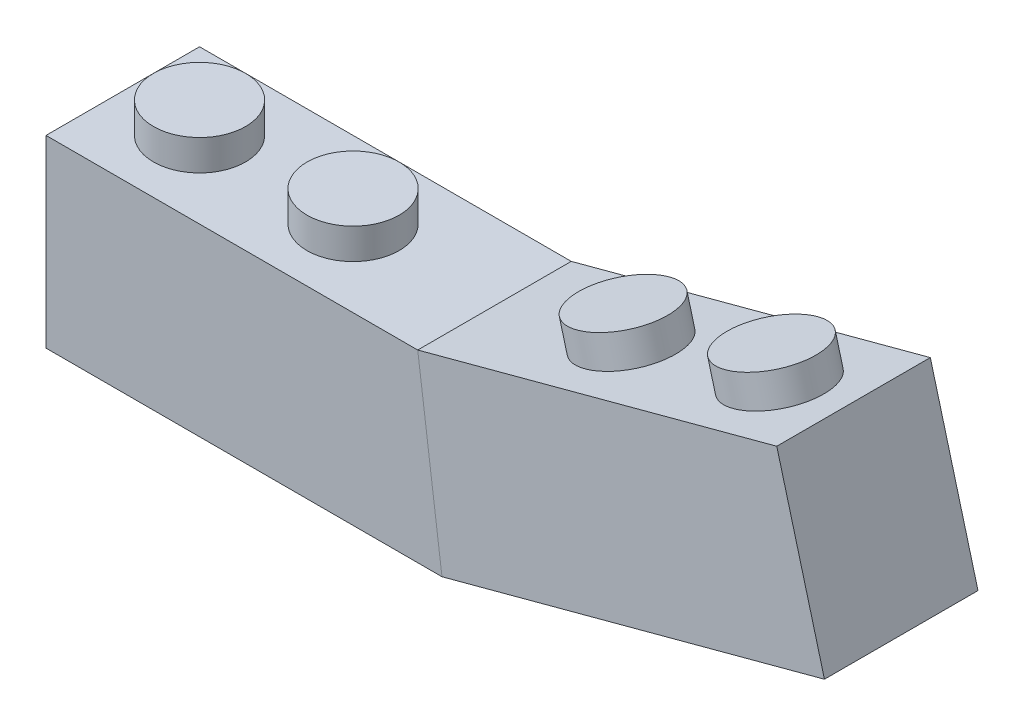
ISO-10303-21;
HEADER;
FILE_DESCRIPTION(('STEP AP214'),'2;1');
FILE_NAME('part.step','',(''),(''),'','','');
FILE_SCHEMA(('AUTOMOTIVE_DESIGN { 1 0 10303 214 1 1 1 1 }'));
ENDSEC;
DATA;
#1=APPLICATION_CONTEXT('core data for automotive mechanical design processes');
#2=APPLICATION_PROTOCOL_DEFINITION('international standard','automotive_design',2000,#1);
#3=PRODUCT_CONTEXT('',#1,'mechanical');
#4=PRODUCT('Part','Part','',(#3));
#5=PRODUCT_RELATED_PRODUCT_CATEGORY('part','',(#4));
#6=PRODUCT_DEFINITION_FORMATION('','',#4);
#7=PRODUCT_DEFINITION_CONTEXT('part definition',#1,'design');
#8=PRODUCT_DEFINITION('design','',#6,#7);
#9=PRODUCT_DEFINITION_SHAPE('','',#8);
#10=(LENGTH_UNIT() NAMED_UNIT(*) SI_UNIT(.MILLI.,.METRE.));
#11=(NAMED_UNIT(*) PLANE_ANGLE_UNIT() SI_UNIT($,.RADIAN.));
#12=(NAMED_UNIT(*) SI_UNIT($,.STERADIAN.) SOLID_ANGLE_UNIT());
#13=UNCERTAINTY_MEASURE_WITH_UNIT(LENGTH_MEASURE(1.E-05),#10,'distance_accuracy_value','');
#14=(GEOMETRIC_REPRESENTATION_CONTEXT(3) GLOBAL_UNCERTAINTY_ASSIGNED_CONTEXT((#13)) GLOBAL_UNIT_ASSIGNED_CONTEXT((#10,
#11,#12)) REPRESENTATION_CONTEXT('',''));
#15=CARTESIAN_POINT('',(0.,0.,0.));
#16=DIRECTION('',(0.,0.,1.));
#17=DIRECTION('',(1.,0.,0.));
#18=AXIS2_PLACEMENT_3D('',#15,#16,#17);
#19=CARTESIAN_POINT('',(39.3185165257814,5.17638090205043,0.));
#20=DIRECTION('',(-0.965925826289068,-0.258819045102522,0.));
#21=DIRECTION('',(0.,0.,1.));
#22=AXIS2_PLACEMENT_3D('',#19,#20,#21);
#23=PLANE('',#22);
#24=DIRECTION('',(-0.258819045102522,0.965925826289068,0.));
#25=VECTOR('',#24,1.);
#26=CARTESIAN_POINT('',(40.5608479422735,0.539936935862907,-4.));
#27=LINE('',#26,#25);
#28=CARTESIAN_POINT('',(40.5608479422735,0.539936935862906,-4.));
#29=VERTEX_POINT('',#28);
#30=CARTESIAN_POINT('',(38.0761851092893,9.81282486823796,-4.));
#31=VERTEX_POINT('',#30);
#32=EDGE_CURVE('E132',#29,#31,#27,.T.);
#33=ORIENTED_EDGE('',*,*,#32,.T.);
#34=DIRECTION('',(0.,0.,1.));
#35=VECTOR('',#34,1.);
#36=CARTESIAN_POINT('',(38.0761851092893,9.81282486823796,4.));
#37=LINE('',#36,#35);
#38=CARTESIAN_POINT('',(38.0761851092893,9.81282486823796,4.));
#39=VERTEX_POINT('',#38);
#40=EDGE_CURVE('E177',#31,#39,#37,.T.);
#41=ORIENTED_EDGE('',*,*,#40,.T.);
#42=DIRECTION('',(0.258819045102522,-0.965925826289068,0.));
#43=VECTOR('',#42,1.);
#44=CARTESIAN_POINT('',(40.5608479422735,0.539936935862907,4.));
#45=LINE('',#44,#43);
#46=CARTESIAN_POINT('',(40.5608479422735,0.539936935862906,4.));
#47=VERTEX_POINT('',#46);
#48=EDGE_CURVE('E173',#39,#47,#45,.T.);
#49=ORIENTED_EDGE('',*,*,#48,.T.);
#50=DIRECTION('',(0.,0.,-1.));
#51=VECTOR('',#50,1.);
#52=CARTESIAN_POINT('',(40.5608479422735,0.539936935862907,4.));
#53=LINE('',#52,#51);
#54=EDGE_CURVE('E86',#47,#29,#53,.T.);
#55=ORIENTED_EDGE('',*,*,#54,.T.);
#56=EDGE_LOOP('',(#33,#41,#49,#55));
#57=FACE_BOUND('',#56,.T.);
#58=ADVANCED_FACE('F41',(#57),#23,.F.);
#59=CARTESIAN_POINT('',(0.,0.,0.));
#60=DIRECTION('',(-1.,0.,0.));
#61=DIRECTION('',(0.,0.,1.));
#62=AXIS2_PLACEMENT_3D('',#59,#60,#61);
#63=PLANE('',#62);
#64=DIRECTION('',(0.,1.,0.));
#65=VECTOR('',#64,1.);
#66=CARTESIAN_POINT('',(0.,-4.8,-4.));
#67=LINE('',#66,#65);
#68=CARTESIAN_POINT('',(0.,-4.8,-4.));
#69=VERTEX_POINT('',#68);
#70=CARTESIAN_POINT('',(0.,4.8,-4.));
#71=VERTEX_POINT('',#70);
#72=EDGE_CURVE('E95',#69,#71,#67,.T.);
#73=ORIENTED_EDGE('',*,*,#72,.F.);
#74=DIRECTION('',(0.,0.,-1.));
#75=VECTOR('',#74,1.);
#76=CARTESIAN_POINT('',(0.,-4.8,4.));
#77=LINE('',#76,#75);
#78=CARTESIAN_POINT('',(0.,-4.8,4.));
#79=VERTEX_POINT('',#78);
#80=EDGE_CURVE('E147',#79,#69,#77,.T.);
#81=ORIENTED_EDGE('',*,*,#80,.F.);
#82=DIRECTION('',(0.,-1.,0.));
#83=VECTOR('',#82,1.);
#84=CARTESIAN_POINT('',(0.,-4.8,4.));
#85=LINE('',#84,#83);
#86=CARTESIAN_POINT('',(0.,4.8,4.));
#87=VERTEX_POINT('',#86);
#88=EDGE_CURVE('E154',#87,#79,#85,.T.);
#89=ORIENTED_EDGE('',*,*,#88,.F.);
#90=DIRECTION('',(0.,0.,1.));
#91=VECTOR('',#90,1.);
#92=CARTESIAN_POINT('',(0.,4.8,4.));
#93=LINE('',#92,#91);
#94=EDGE_CURVE('E158',#71,#87,#93,.T.);
#95=ORIENTED_EDGE('',*,*,#94,.F.);
#96=EDGE_LOOP('',(#73,#81,#89,#95));
#97=FACE_BOUND('',#96,.T.);
#98=ADVANCED_FACE('F387',(#97),#63,.T.);
#99=CARTESIAN_POINT('',(20.4742994629833,-4.8422375078915,-4.));
#100=DIRECTION('',(0.,0.,-1.));
#101=DIRECTION('',(-1.,0.,0.));
#102=AXIS2_PLACEMENT_3D('',#99,#100,#101);
#103=PLANE('',#102);
#104=DIRECTION('',(0.130526192220052,-0.99144486137381,0.));
#105=VECTOR('',#104,1.);
#106=CARTESIAN_POINT('',(20.2804239711367,-2.13003153206855,-4.));
#107=LINE('',#106,#105);
#108=CARTESIAN_POINT('',(19.3680680115805,4.8,-4.));
#109=VERTEX_POINT('',#108);
#110=CARTESIAN_POINT('',(20.6319319884195,-4.8,-4.));
#111=VERTEX_POINT('',#110);
#112=EDGE_CURVE('E131',#109,#111,#107,.T.);
#113=ORIENTED_EDGE('',*,*,#112,.F.);
#114=DIRECTION('',(0.965925826289068,0.258819045102522,0.));
#115=VECTOR('',#114,1.);
#116=CARTESIAN_POINT('',(17.9896366299991,4.43065042448355,-4.));
#117=LINE('',#116,#115);
#118=EDGE_CURVE('E134',#109,#31,#117,.T.);
#119=ORIENTED_EDGE('',*,*,#118,.T.);
#120=ORIENTED_EDGE('',*,*,#32,.F.);
#121=DIRECTION('',(0.965925826289068,0.258819045102522,0.));
#122=VECTOR('',#121,1.);
#123=CARTESIAN_POINT('',(20.4742994629833,-4.8422375078915,-4.));
#124=LINE('',#123,#122);
#125=EDGE_CURVE('E44',#111,#29,#124,.T.);
#126=ORIENTED_EDGE('',*,*,#125,.F.);
#127=EDGE_LOOP('',(#113,#119,#120,#126));
#128=FACE_BOUND('',#127,.T.);
#129=ADVANCED_FACE('F129',(#128),#103,.T.);
#130=CARTESIAN_POINT('',(17.9896366299991,4.43065042448355,4.));
#131=DIRECTION('',(-0.258819045102522,0.965925826289068,0.));
#132=DIRECTION('',(-0.965925826289068,-0.258819045102522,0.));
#133=AXIS2_PLACEMENT_3D('',#130,#131,#132);
#134=PLANE('',#133);
#135=CARTESIAN_POINT('',(26.4850751938204,6.7069963270077,0.));
#136=DIRECTION('',(-0.258819045102522,0.965925826289068,0.));
#137=DIRECTION('',(-0.965925826289068,-0.258819045102522,0.));
#138=AXIS2_PLACEMENT_3D('',#135,#136,#137);
#139=CIRCLE('',#138,2.4);
#140=CARTESIAN_POINT('',(24.1668532107267,6.08583061876165,0.));
#141=VERTEX_POINT('',#140);
#142=EDGE_CURVE('E228',#141,#141,#139,.T.);
#143=ORIENTED_EDGE('',*,*,#142,.F.);
#144=EDGE_LOOP('',(#143));
#145=FACE_BOUND('',#144,.T.);
#146=CARTESIAN_POINT('',(34.212481804133,8.77754868782787,0.));
#147=DIRECTION('',(-0.258819045102522,0.965925826289068,0.));
#148=DIRECTION('',(-0.965925826289068,-0.258819045102522,0.));
#149=AXIS2_PLACEMENT_3D('',#146,#147,#148);
#150=CIRCLE('',#149,2.4);
#151=CARTESIAN_POINT('',(31.8942598210392,8.15638297958182,0.));
#152=VERTEX_POINT('',#151);
#153=EDGE_CURVE('E220',#152,#152,#150,.T.);
#154=ORIENTED_EDGE('',*,*,#153,.F.);
#155=EDGE_LOOP('',(#154));
#156=FACE_BOUND('',#155,.T.);
#157=DIRECTION('',(0.,0.,-1.));
#158=VECTOR('',#157,1.);
#159=CARTESIAN_POINT('',(19.3680680115805,4.8,4.));
#160=LINE('',#159,#158);
#161=CARTESIAN_POINT('',(19.3680680115805,4.8,4.));
#162=VERTEX_POINT('',#161);
#163=EDGE_CURVE('E11',#162,#109,#160,.T.);
#164=ORIENTED_EDGE('',*,*,#163,.F.);
#165=DIRECTION('',(0.965925826289068,0.258819045102522,0.));
#166=VECTOR('',#165,1.);
#167=CARTESIAN_POINT('',(17.9896366299991,4.43065042448355,4.));
#168=LINE('',#167,#166);
#169=EDGE_CURVE('E186',#162,#39,#168,.T.);
#170=ORIENTED_EDGE('',*,*,#169,.T.);
#171=ORIENTED_EDGE('',*,*,#40,.F.);
#172=ORIENTED_EDGE('',*,*,#118,.F.);
#173=EDGE_LOOP('',(#164,#170,#171,#172));
#174=FACE_BOUND('',#173,.T.);
#175=ADVANCED_FACE('F190',(#145,#156,#174),#134,.T.);
#176=CARTESIAN_POINT('',(20.4742994629833,-4.8422375078915,4.));
#177=DIRECTION('',(0.,0.,1.));
#178=DIRECTION('',(1.,0.,0.));
#179=AXIS2_PLACEMENT_3D('',#176,#177,#178);
#180=PLANE('',#179);
#181=DIRECTION('',(-0.130526192220052,0.99144486137381,0.));
#182=VECTOR('',#181,1.);
#183=CARTESIAN_POINT('',(20.2804239711367,-2.13003153206855,4.));
#184=LINE('',#183,#182);
#185=CARTESIAN_POINT('',(20.6319319884195,-4.8,4.));
#186=VERTEX_POINT('',#185);
#187=EDGE_CURVE('E50',#186,#162,#184,.T.);
#188=ORIENTED_EDGE('',*,*,#187,.F.);
#189=DIRECTION('',(0.965925826289068,0.258819045102522,0.));
#190=VECTOR('',#189,1.);
#191=CARTESIAN_POINT('',(20.4742994629833,-4.8422375078915,4.));
#192=LINE('',#191,#190);
#193=EDGE_CURVE('E182',#186,#47,#192,.T.);
#194=ORIENTED_EDGE('',*,*,#193,.T.);
#195=ORIENTED_EDGE('',*,*,#48,.F.);
#196=ORIENTED_EDGE('',*,*,#169,.F.);
#197=EDGE_LOOP('',(#188,#194,#195,#196));
#198=FACE_BOUND('',#197,.T.);
#199=ADVANCED_FACE('F385',(#198),#180,.T.);
#200=CARTESIAN_POINT('',(20.4742994629833,-4.8422375078915,4.));
#201=DIRECTION('',(0.258819045102522,-0.965925826289068,0.));
#202=DIRECTION('',(0.965925826289068,0.258819045102522,0.));
#203=AXIS2_PLACEMENT_3D('',#200,#201,#202);
#204=PLANE('',#203);
#205=DIRECTION('',(0.965925826289068,0.258819045102522,0.));
#206=VECTOR('',#205,1.);
#207=CARTESIAN_POINT('',(20.4742994629833,-4.8422375078915,-2.4));
#208=LINE('',#207,#206);
#209=CARTESIAN_POINT('',(20.6319319884195,-4.8,-2.4));
#210=VERTEX_POINT('',#209);
#211=CARTESIAN_POINT('',(39.015366620211,0.125826463698873,-2.4));
#212=VERTEX_POINT('',#211);
#213=EDGE_CURVE('E120',#210,#212,#208,.T.);
#214=ORIENTED_EDGE('',*,*,#213,.F.);
#215=DIRECTION('',(0.,0.,1.));
#216=VECTOR('',#215,1.);
#217=CARTESIAN_POINT('',(20.6319319884195,-4.8,4.));
#218=LINE('',#217,#216);
#219=EDGE_CURVE('E114',#111,#210,#218,.T.);
#220=ORIENTED_EDGE('',*,*,#219,.F.);
#221=ORIENTED_EDGE('',*,*,#125,.T.);
#222=ORIENTED_EDGE('',*,*,#54,.F.);
#223=ORIENTED_EDGE('',*,*,#193,.F.);
#224=CARTESIAN_POINT('',(20.6319319884195,-4.8,2.4));
#225=VERTEX_POINT('',#224);
#226=EDGE_CURVE('E125',#225,#186,#218,.T.);
#227=ORIENTED_EDGE('',*,*,#226,.F.);
#228=DIRECTION('',(0.965925826289068,0.258819045102522,0.));
#229=VECTOR('',#228,1.);
#230=CARTESIAN_POINT('',(20.4742994629833,-4.8422375078915,2.4));
#231=LINE('',#230,#229);
#232=CARTESIAN_POINT('',(39.015366620211,0.125826463698873,2.4));
#233=VERTEX_POINT('',#232);
#234=EDGE_CURVE('E254',#225,#233,#231,.T.);
#235=ORIENTED_EDGE('',*,*,#234,.T.);
#236=DIRECTION('',(0.,0.,-1.));
#237=VECTOR('',#236,1.);
#238=CARTESIAN_POINT('',(39.015366620211,0.125826463698872,4.));
#239=LINE('',#238,#237);
#240=EDGE_CURVE('E260',#233,#212,#239,.T.);
#241=ORIENTED_EDGE('',*,*,#240,.T.);
#242=EDGE_LOOP('',(#214,#220,#221,#222,#223,#227,#235,#241));
#243=FACE_BOUND('',#242,.T.);
#244=ADVANCED_FACE('F116',(#243),#204,.T.);
#245=CARTESIAN_POINT('',(0.,-4.8,4.));
#246=DIRECTION('',(0.,-1.,0.));
#247=DIRECTION('',(0.,0.,-1.));
#248=AXIS2_PLACEMENT_3D('',#245,#246,#247);
#249=PLANE('',#248);
#250=DIRECTION('',(1.,0.,0.));
#251=VECTOR('',#250,1.);
#252=CARTESIAN_POINT('',(0.,-4.8,-2.4));
#253=LINE('',#252,#251);
#254=CARTESIAN_POINT('',(1.6,-4.8,-2.4));
#255=VERTEX_POINT('',#254);
#256=EDGE_CURVE('E240',#255,#210,#253,.T.);
#257=ORIENTED_EDGE('',*,*,#256,.F.);
#258=DIRECTION('',(0.,0.,-1.));
#259=VECTOR('',#258,1.);
#260=CARTESIAN_POINT('',(1.6,-4.8,4.));
#261=LINE('',#260,#259);
#262=CARTESIAN_POINT('',(1.6,-4.8,2.4));
#263=VERTEX_POINT('',#262);
#264=EDGE_CURVE('E245',#263,#255,#261,.T.);
#265=ORIENTED_EDGE('',*,*,#264,.F.);
#266=DIRECTION('',(1.,0.,0.));
#267=VECTOR('',#266,1.);
#268=CARTESIAN_POINT('',(0.,-4.8,2.4));
#269=LINE('',#268,#267);
#270=EDGE_CURVE('E58',#263,#225,#269,.T.);
#271=ORIENTED_EDGE('',*,*,#270,.T.);
#272=ORIENTED_EDGE('',*,*,#226,.T.);
#273=DIRECTION('',(1.,0.,0.));
#274=VECTOR('',#273,1.);
#275=CARTESIAN_POINT('',(0.,-4.8,4.));
#276=LINE('',#275,#274);
#277=EDGE_CURVE('E143',#79,#186,#276,.T.);
#278=ORIENTED_EDGE('',*,*,#277,.F.);
#279=ORIENTED_EDGE('',*,*,#80,.T.);
#280=DIRECTION('',(1.,0.,0.));
#281=VECTOR('',#280,1.);
#282=CARTESIAN_POINT('',(0.,-4.8,-4.));
#283=LINE('',#282,#281);
#284=EDGE_CURVE('E139',#69,#111,#283,.T.);
#285=ORIENTED_EDGE('',*,*,#284,.T.);
#286=ORIENTED_EDGE('',*,*,#219,.T.);
#287=EDGE_LOOP('',(#257,#265,#271,#272,#278,#279,#285,#286));
#288=FACE_BOUND('',#287,.T.);
#289=ADVANCED_FACE('F145',(#288),#249,.T.);
#290=CARTESIAN_POINT('',(0.,-4.8,4.));
#291=DIRECTION('',(0.,0.,1.));
#292=DIRECTION('',(1.,0.,0.));
#293=AXIS2_PLACEMENT_3D('',#290,#291,#292);
#294=PLANE('',#293);
#295=ORIENTED_EDGE('',*,*,#277,.T.);
#296=ORIENTED_EDGE('',*,*,#187,.T.);
#297=DIRECTION('',(1.,0.,0.));
#298=VECTOR('',#297,1.);
#299=CARTESIAN_POINT('',(0.,4.8,4.));
#300=LINE('',#299,#298);
#301=EDGE_CURVE('E152',#87,#162,#300,.T.);
#302=ORIENTED_EDGE('',*,*,#301,.F.);
#303=ORIENTED_EDGE('',*,*,#88,.T.);
#304=EDGE_LOOP('',(#295,#296,#302,#303));
#305=FACE_BOUND('',#304,.T.);
#306=ADVANCED_FACE('F196',(#305),#294,.T.);
#307=CARTESIAN_POINT('',(0.,4.8,4.));
#308=DIRECTION('',(0.,1.,0.));
#309=DIRECTION('',(0.,0.,1.));
#310=AXIS2_PLACEMENT_3D('',#307,#308,#309);
#311=PLANE('',#310);
#312=CARTESIAN_POINT('',(12.,4.8,0.));
#313=DIRECTION('',(0.,1.,0.));
#314=DIRECTION('',(0.,0.,1.));
#315=AXIS2_PLACEMENT_3D('',#312,#313,#314);
#316=CIRCLE('',#315,2.4);
#317=CARTESIAN_POINT('',(12.,4.8,2.4));
#318=VERTEX_POINT('',#317);
#319=EDGE_CURVE('E212',#318,#318,#316,.T.);
#320=ORIENTED_EDGE('',*,*,#319,.F.);
#321=EDGE_LOOP('',(#320));
#322=FACE_BOUND('',#321,.T.);
#323=CARTESIAN_POINT('',(4.,4.8,0.));
#324=DIRECTION('',(0.,1.,0.));
#325=DIRECTION('',(0.,0.,1.));
#326=AXIS2_PLACEMENT_3D('',#323,#324,#325);
#327=CIRCLE('',#326,2.4);
#328=CARTESIAN_POINT('',(4.,4.8,2.4));
#329=VERTEX_POINT('',#328);
#330=EDGE_CURVE('E204',#329,#329,#327,.T.);
#331=ORIENTED_EDGE('',*,*,#330,.F.);
#332=EDGE_LOOP('',(#331));
#333=FACE_BOUND('',#332,.T.);
#334=ORIENTED_EDGE('',*,*,#301,.T.);
#335=ORIENTED_EDGE('',*,*,#163,.T.);
#336=DIRECTION('',(1.,0.,0.));
#337=VECTOR('',#336,1.);
#338=CARTESIAN_POINT('',(0.,4.8,-4.));
#339=LINE('',#338,#337);
#340=EDGE_CURVE('E141',#71,#109,#339,.T.);
#341=ORIENTED_EDGE('',*,*,#340,.F.);
#342=ORIENTED_EDGE('',*,*,#94,.T.);
#343=EDGE_LOOP('',(#334,#335,#341,#342));
#344=FACE_BOUND('',#343,.T.);
#345=ADVANCED_FACE('F192',(#322,#333,#344),#311,.T.);
#346=CARTESIAN_POINT('',(0.,-4.8,-4.));
#347=DIRECTION('',(0.,0.,-1.));
#348=DIRECTION('',(-1.,0.,0.));
#349=AXIS2_PLACEMENT_3D('',#346,#347,#348);
#350=PLANE('',#349);
#351=ORIENTED_EDGE('',*,*,#340,.T.);
#352=ORIENTED_EDGE('',*,*,#112,.T.);
#353=ORIENTED_EDGE('',*,*,#284,.F.);
#354=ORIENTED_EDGE('',*,*,#72,.T.);
#355=EDGE_LOOP('',(#351,#352,#353,#354));
#356=FACE_BOUND('',#355,.T.);
#357=ADVANCED_FACE('F138',(#356),#350,.T.);
#358=CARTESIAN_POINT('',(4.,6.4,0.));
#359=DIRECTION('',(0.,-1.,0.));
#360=DIRECTION('',(0.,0.,-1.));
#361=AXIS2_PLACEMENT_3D('',#358,#359,#360);
#362=CYLINDRICAL_SURFACE('',#361,2.4);
#363=CARTESIAN_POINT('',(4.,6.4,0.));
#364=DIRECTION('',(0.,1.,0.));
#365=DIRECTION('',(0.,0.,1.));
#366=AXIS2_PLACEMENT_3D('',#363,#364,#365);
#367=CIRCLE('',#366,2.4);
#368=CARTESIAN_POINT('',(4.,6.4,2.4));
#369=VERTEX_POINT('',#368);
#370=EDGE_CURVE('E174',#369,#369,#367,.T.);
#371=ORIENTED_EDGE('',*,*,#370,.F.);
#372=EDGE_LOOP('',(#371));
#373=FACE_BOUND('',#372,.T.);
#374=ORIENTED_EDGE('',*,*,#330,.T.);
#375=EDGE_LOOP('',(#374));
#376=FACE_BOUND('',#375,.T.);
#377=ADVANCED_FACE('F388',(#373,#376),#362,.T.);
#378=CARTESIAN_POINT('',(4.,6.4,0.));
#379=DIRECTION('',(0.,1.,0.));
#380=DIRECTION('',(0.,0.,1.));
#381=AXIS2_PLACEMENT_3D('',#378,#379,#380);
#382=PLANE('',#381);
#383=ORIENTED_EDGE('',*,*,#370,.T.);
#384=EDGE_LOOP('',(#383));
#385=FACE_BOUND('',#384,.T.);
#386=ADVANCED_FACE('F393',(#385),#382,.T.);
#387=CARTESIAN_POINT('',(12.,6.4,0.));
#388=DIRECTION('',(0.,-1.,0.));
#389=DIRECTION('',(0.,0.,-1.));
#390=AXIS2_PLACEMENT_3D('',#387,#388,#389);
#391=CYLINDRICAL_SURFACE('',#390,2.4);
#392=CARTESIAN_POINT('',(12.,6.4,0.));
#393=DIRECTION('',(0.,1.,0.));
#394=DIRECTION('',(0.,0.,1.));
#395=AXIS2_PLACEMENT_3D('',#392,#393,#394);
#396=CIRCLE('',#395,2.4);
#397=CARTESIAN_POINT('',(12.,6.4,2.4));
#398=VERTEX_POINT('',#397);
#399=EDGE_CURVE('E208',#398,#398,#396,.T.);
#400=ORIENTED_EDGE('',*,*,#399,.F.);
#401=EDGE_LOOP('',(#400));
#402=FACE_BOUND('',#401,.T.);
#403=ORIENTED_EDGE('',*,*,#319,.T.);
#404=EDGE_LOOP('',(#403));
#405=FACE_BOUND('',#404,.T.);
#406=ADVANCED_FACE('F446',(#402,#405),#391,.T.);
#407=CARTESIAN_POINT('',(12.,6.4,0.));
#408=DIRECTION('',(0.,1.,0.));
#409=DIRECTION('',(0.,0.,1.));
#410=AXIS2_PLACEMENT_3D('',#407,#408,#409);
#411=PLANE('',#410);
#412=ORIENTED_EDGE('',*,*,#399,.T.);
#413=EDGE_LOOP('',(#412));
#414=FACE_BOUND('',#413,.T.);
#415=ADVANCED_FACE('F451',(#414),#411,.T.);
#416=CARTESIAN_POINT('',(33.798371331969,10.3230300098904,0.));
#417=DIRECTION('',(0.258819045102522,-0.965925826289068,0.));
#418=DIRECTION('',(0.965925826289068,0.258819045102522,0.));
#419=AXIS2_PLACEMENT_3D('',#416,#417,#418);
#420=CYLINDRICAL_SURFACE('',#419,2.4);
#421=CARTESIAN_POINT('',(33.798371331969,10.3230300098904,0.));
#422=DIRECTION('',(-0.258819045102522,0.965925826289068,0.));
#423=DIRECTION('',(-0.965925826289068,-0.258819045102522,0.));
#424=AXIS2_PLACEMENT_3D('',#421,#422,#423);
#425=CIRCLE('',#424,2.4);
#426=CARTESIAN_POINT('',(31.4801493488752,9.70186430164433,0.));
#427=VERTEX_POINT('',#426);
#428=EDGE_CURVE('E216',#427,#427,#425,.T.);
#429=ORIENTED_EDGE('',*,*,#428,.F.);
#430=EDGE_LOOP('',(#429));
#431=FACE_BOUND('',#430,.T.);
#432=ORIENTED_EDGE('',*,*,#153,.T.);
#433=EDGE_LOOP('',(#432));
#434=FACE_BOUND('',#433,.T.);
#435=ADVANCED_FACE('F461',(#431,#434),#420,.T.);
#436=CARTESIAN_POINT('',(33.798371331969,10.3230300098904,0.));
#437=DIRECTION('',(-0.258819045102522,0.965925826289068,0.));
#438=DIRECTION('',(-0.965925826289068,-0.258819045102522,0.));
#439=AXIS2_PLACEMENT_3D('',#436,#437,#438);
#440=PLANE('',#439);
#441=ORIENTED_EDGE('',*,*,#428,.T.);
#442=EDGE_LOOP('',(#441));
#443=FACE_BOUND('',#442,.T.);
#444=ADVANCED_FACE('F471',(#443),#440,.T.);
#445=CARTESIAN_POINT('',(26.0709647216564,8.25247764907021,0.));
#446=DIRECTION('',(0.258819045102522,-0.965925826289068,0.));
#447=DIRECTION('',(0.965925826289068,0.258819045102522,0.));
#448=AXIS2_PLACEMENT_3D('',#445,#446,#447);
#449=CYLINDRICAL_SURFACE('',#448,2.4);
#450=CARTESIAN_POINT('',(26.0709647216564,8.25247764907021,0.));
#451=DIRECTION('',(-0.258819045102522,0.965925826289068,0.));
#452=DIRECTION('',(-0.965925826289068,-0.258819045102522,0.));
#453=AXIS2_PLACEMENT_3D('',#450,#451,#452);
#454=CIRCLE('',#453,2.4);
#455=CARTESIAN_POINT('',(23.7527427385626,7.63131194082416,0.));
#456=VERTEX_POINT('',#455);
#457=EDGE_CURVE('E224',#456,#456,#454,.T.);
#458=ORIENTED_EDGE('',*,*,#457,.F.);
#459=EDGE_LOOP('',(#458));
#460=FACE_BOUND('',#459,.T.);
#461=ORIENTED_EDGE('',*,*,#142,.T.);
#462=EDGE_LOOP('',(#461));
#463=FACE_BOUND('',#462,.T.);
#464=ADVANCED_FACE('F481',(#460,#463),#449,.T.);
#465=CARTESIAN_POINT('',(26.0709647216564,8.25247764907021,0.));
#466=DIRECTION('',(-0.258819045102522,0.965925826289068,0.));
#467=DIRECTION('',(-0.965925826289068,-0.258819045102522,0.));
#468=AXIS2_PLACEMENT_3D('',#465,#466,#467);
#469=PLANE('',#468);
#470=ORIENTED_EDGE('',*,*,#457,.T.);
#471=EDGE_LOOP('',(#470));
#472=FACE_BOUND('',#471,.T.);
#473=ADVANCED_FACE('F499',(#472),#469,.T.);
#474=CARTESIAN_POINT('',(37.7730352037188,4.7622704298864,0.));
#475=DIRECTION('',(-0.965925826289068,-0.258819045102522,0.));
#476=DIRECTION('',(0.,0.,1.));
#477=AXIS2_PLACEMENT_3D('',#474,#475,#476);
#478=PLANE('',#477);
#479=DIRECTION('',(-0.258819045102522,0.965925826289068,0.));
#480=VECTOR('',#479,1.);
#481=CARTESIAN_POINT('',(39.015366620211,0.12582646369887,-2.4));
#482=LINE('',#481,#480);
#483=CARTESIAN_POINT('',(36.9448142593908,7.85323307401141,-2.4));
#484=VERTEX_POINT('',#483);
#485=EDGE_CURVE('E259',#212,#484,#482,.T.);
#486=ORIENTED_EDGE('',*,*,#485,.F.);
#487=ORIENTED_EDGE('',*,*,#240,.F.);
#488=DIRECTION('',(0.258819045102522,-0.965925826289068,0.));
#489=VECTOR('',#488,1.);
#490=CARTESIAN_POINT('',(39.015366620211,0.12582646369887,2.4));
#491=LINE('',#490,#489);
#492=CARTESIAN_POINT('',(36.9448142593908,7.85323307401141,2.4));
#493=VERTEX_POINT('',#492);
#494=EDGE_CURVE('E263',#493,#233,#491,.T.);
#495=ORIENTED_EDGE('',*,*,#494,.F.);
#496=DIRECTION('',(0.,0.,1.));
#497=VECTOR('',#496,1.);
#498=CARTESIAN_POINT('',(36.9448142593908,7.85323307401141,4.));
#499=LINE('',#498,#497);
#500=EDGE_CURVE('E330',#484,#493,#499,.T.);
#501=ORIENTED_EDGE('',*,*,#500,.F.);
#502=EDGE_LOOP('',(#486,#487,#495,#501));
#503=FACE_BOUND('',#502,.T.);
#504=ADVANCED_FACE('F348',(#503),#478,.T.);
#505=CARTESIAN_POINT('',(1.6,0.,0.));
#506=DIRECTION('',(-1.,0.,0.));
#507=DIRECTION('',(0.,0.,1.));
#508=AXIS2_PLACEMENT_3D('',#505,#506,#507);
#509=PLANE('',#508);
#510=DIRECTION('',(0.,1.,0.));
#511=VECTOR('',#510,1.);
#512=CARTESIAN_POINT('',(1.6,-4.8,-2.4));
#513=LINE('',#512,#511);
#514=CARTESIAN_POINT('',(1.6,3.2,-2.4));
#515=VERTEX_POINT('',#514);
#516=EDGE_CURVE('E238',#255,#515,#513,.T.);
#517=ORIENTED_EDGE('',*,*,#516,.T.);
#518=DIRECTION('',(0.,0.,1.));
#519=VECTOR('',#518,1.);
#520=CARTESIAN_POINT('',(1.6,3.2,4.));
#521=LINE('',#520,#519);
#522=CARTESIAN_POINT('',(1.6,3.2,2.4));
#523=VERTEX_POINT('',#522);
#524=EDGE_CURVE('E293',#515,#523,#521,.T.);
#525=ORIENTED_EDGE('',*,*,#524,.T.);
#526=DIRECTION('',(0.,-1.,0.));
#527=VECTOR('',#526,1.);
#528=CARTESIAN_POINT('',(1.6,-4.8,2.4));
#529=LINE('',#528,#527);
#530=EDGE_CURVE('E249',#523,#263,#529,.T.);
#531=ORIENTED_EDGE('',*,*,#530,.T.);
#532=ORIENTED_EDGE('',*,*,#264,.T.);
#533=EDGE_LOOP('',(#517,#525,#531,#532));
#534=FACE_BOUND('',#533,.T.);
#535=ADVANCED_FACE('F377',(#534),#509,.F.);
#536=CARTESIAN_POINT('',(20.4742994629833,-4.8422375078915,-2.4));
#537=DIRECTION('',(0.,0.,-1.));
#538=DIRECTION('',(-1.,0.,0.));
#539=AXIS2_PLACEMENT_3D('',#536,#537,#538);
#540=PLANE('',#539);
#541=DIRECTION('',(0.130526192220052,-0.99144486137381,0.));
#542=VECTOR('',#541,1.);
#543=CARTESIAN_POINT('',(20.2804239711367,-2.13003153206855,-2.4));
#544=LINE('',#543,#542);
#545=CARTESIAN_POINT('',(19.5787120077203,3.2,-2.4));
#546=VERTEX_POINT('',#545);
#547=EDGE_CURVE('E252',#546,#210,#544,.T.);
#548=ORIENTED_EDGE('',*,*,#547,.T.);
#549=ORIENTED_EDGE('',*,*,#213,.T.);
#550=ORIENTED_EDGE('',*,*,#485,.T.);
#551=DIRECTION('',(0.965925826289068,0.258819045102522,0.));
#552=VECTOR('',#551,1.);
#553=CARTESIAN_POINT('',(18.4037471021632,2.88516910242104,-2.4));
#554=LINE('',#553,#552);
#555=EDGE_CURVE('E239',#546,#484,#554,.T.);
#556=ORIENTED_EDGE('',*,*,#555,.F.);
#557=EDGE_LOOP('',(#548,#549,#550,#556));
#558=FACE_BOUND('',#557,.T.);
#559=ADVANCED_FACE('F341',(#558),#540,.F.);
#560=CARTESIAN_POINT('',(18.4037471021632,2.88516910242104,4.));
#561=DIRECTION('',(-0.258819045102522,0.965925826289068,0.));
#562=DIRECTION('',(-0.965925826289068,-0.258819045102522,0.));
#563=AXIS2_PLACEMENT_3D('',#560,#561,#562);
#564=PLANE('',#563);
#565=CARTESIAN_POINT('',(26.8991856659845,5.16151500494519,0.));
#566=DIRECTION('',(-0.258819045102522,0.965925826289068,0.));
#567=DIRECTION('',(-0.965925826289068,-0.258819045102522,0.));
#568=AXIS2_PLACEMENT_3D('',#565,#566,#567);
#569=CIRCLE('',#568,0.800000000000005);
#570=CARTESIAN_POINT('',(26.1264450049532,4.95445976886317,0.));
#571=VERTEX_POINT('',#570);
#572=EDGE_CURVE('E270',#571,#571,#569,.T.);
#573=ORIENTED_EDGE('',*,*,#572,.T.);
#574=EDGE_LOOP('',(#573));
#575=FACE_BOUND('',#574,.T.);
#576=CARTESIAN_POINT('',(34.626592276297,7.23206736576536,0.));
#577=DIRECTION('',(-0.258819045102522,0.965925826289068,0.));
#578=DIRECTION('',(-0.965925826289068,-0.258819045102522,0.));
#579=AXIS2_PLACEMENT_3D('',#576,#577,#578);
#580=CIRCLE('',#579,0.800000000000005);
#581=CARTESIAN_POINT('',(33.8538516152658,7.02501212968335,0.));
#582=VERTEX_POINT('',#581);
#583=EDGE_CURVE('E269',#582,#582,#580,.T.);
#584=ORIENTED_EDGE('',*,*,#583,.T.);
#585=EDGE_LOOP('',(#584));
#586=FACE_BOUND('',#585,.T.);
#587=DIRECTION('',(0.,0.,-1.));
#588=VECTOR('',#587,1.);
#589=CARTESIAN_POINT('',(19.5787120077203,3.2,4.));
#590=LINE('',#589,#588);
#591=CARTESIAN_POINT('',(19.5787120077203,3.2,2.4));
#592=VERTEX_POINT('',#591);
#593=EDGE_CURVE('E232',#592,#546,#590,.T.);
#594=ORIENTED_EDGE('',*,*,#593,.T.);
#595=ORIENTED_EDGE('',*,*,#555,.T.);
#596=ORIENTED_EDGE('',*,*,#500,.T.);
#597=DIRECTION('',(0.965925826289068,0.258819045102522,0.));
#598=VECTOR('',#597,1.);
#599=CARTESIAN_POINT('',(18.4037471021632,2.88516910242104,2.4));
#600=LINE('',#599,#598);
#601=EDGE_CURVE('E258',#592,#493,#600,.T.);
#602=ORIENTED_EDGE('',*,*,#601,.F.);
#603=EDGE_LOOP('',(#594,#595,#596,#602));
#604=FACE_BOUND('',#603,.T.);
#605=ADVANCED_FACE('F351',(#575,#586,#604),#564,.F.);
#606=CARTESIAN_POINT('',(20.4742994629833,-4.8422375078915,2.4));
#607=DIRECTION('',(0.,0.,1.));
#608=DIRECTION('',(1.,0.,0.));
#609=AXIS2_PLACEMENT_3D('',#606,#607,#608);
#610=PLANE('',#609);
#611=DIRECTION('',(-0.130526192220052,0.99144486137381,0.));
#612=VECTOR('',#611,1.);
#613=CARTESIAN_POINT('',(20.2804239711367,-2.13003153206855,2.4));
#614=LINE('',#613,#612);
#615=EDGE_CURVE('E305',#225,#592,#614,.T.);
#616=ORIENTED_EDGE('',*,*,#615,.T.);
#617=ORIENTED_EDGE('',*,*,#601,.T.);
#618=ORIENTED_EDGE('',*,*,#494,.T.);
#619=ORIENTED_EDGE('',*,*,#234,.F.);
#620=EDGE_LOOP('',(#616,#617,#618,#619));
#621=FACE_BOUND('',#620,.T.);
#622=ADVANCED_FACE('F382',(#621),#610,.F.);
#623=CARTESIAN_POINT('',(0.,-4.8,2.4));
#624=DIRECTION('',(0.,0.,1.));
#625=DIRECTION('',(1.,0.,0.));
#626=AXIS2_PLACEMENT_3D('',#623,#624,#625);
#627=PLANE('',#626);
#628=ORIENTED_EDGE('',*,*,#270,.F.);
#629=ORIENTED_EDGE('',*,*,#530,.F.);
#630=DIRECTION('',(1.,0.,0.));
#631=VECTOR('',#630,1.);
#632=CARTESIAN_POINT('',(0.,3.2,2.4));
#633=LINE('',#632,#631);
#634=EDGE_CURVE('E253',#523,#592,#633,.T.);
#635=ORIENTED_EDGE('',*,*,#634,.T.);
#636=ORIENTED_EDGE('',*,*,#615,.F.);
#637=EDGE_LOOP('',(#628,#629,#635,#636));
#638=FACE_BOUND('',#637,.T.);
#639=ADVANCED_FACE('F378',(#638),#627,.F.);
#640=CARTESIAN_POINT('',(0.,3.2,4.));
#641=DIRECTION('',(0.,1.,0.));
#642=DIRECTION('',(0.,0.,1.));
#643=AXIS2_PLACEMENT_3D('',#640,#641,#642);
#644=PLANE('',#643);
#645=CARTESIAN_POINT('',(12.,3.2,0.));
#646=DIRECTION('',(0.,1.,0.));
#647=DIRECTION('',(0.,0.,1.));
#648=AXIS2_PLACEMENT_3D('',#645,#646,#647);
#649=CIRCLE('',#648,0.799999999999999);
#650=CARTESIAN_POINT('',(12.,3.2,0.799999999999999));
#651=VERTEX_POINT('',#650);
#652=EDGE_CURVE('E275',#651,#651,#649,.T.);
#653=ORIENTED_EDGE('',*,*,#652,.T.);
#654=EDGE_LOOP('',(#653));
#655=FACE_BOUND('',#654,.T.);
#656=CARTESIAN_POINT('',(4.,3.2,0.));
#657=DIRECTION('',(0.,1.,0.));
#658=DIRECTION('',(0.,0.,1.));
#659=AXIS2_PLACEMENT_3D('',#656,#657,#658);
#660=CIRCLE('',#659,0.799999999999999);
#661=CARTESIAN_POINT('',(4.,3.2,0.799999999999999));
#662=VERTEX_POINT('',#661);
#663=EDGE_CURVE('E280',#662,#662,#660,.T.);
#664=ORIENTED_EDGE('',*,*,#663,.T.);
#665=EDGE_LOOP('',(#664));
#666=FACE_BOUND('',#665,.T.);
#667=ORIENTED_EDGE('',*,*,#634,.F.);
#668=ORIENTED_EDGE('',*,*,#524,.F.);
#669=DIRECTION('',(1.,0.,0.));
#670=VECTOR('',#669,1.);
#671=CARTESIAN_POINT('',(0.,3.2,-2.4));
#672=LINE('',#671,#670);
#673=EDGE_CURVE('E244',#515,#546,#672,.T.);
#674=ORIENTED_EDGE('',*,*,#673,.T.);
#675=ORIENTED_EDGE('',*,*,#593,.F.);
#676=EDGE_LOOP('',(#667,#668,#674,#675));
#677=FACE_BOUND('',#676,.T.);
#678=ADVANCED_FACE('F360',(#655,#666,#677),#644,.F.);
#679=CARTESIAN_POINT('',(0.,-4.8,-2.4));
#680=DIRECTION('',(0.,0.,-1.));
#681=DIRECTION('',(-1.,0.,0.));
#682=AXIS2_PLACEMENT_3D('',#679,#680,#681);
#683=PLANE('',#682);
#684=ORIENTED_EDGE('',*,*,#673,.F.);
#685=ORIENTED_EDGE('',*,*,#516,.F.);
#686=ORIENTED_EDGE('',*,*,#256,.T.);
#687=ORIENTED_EDGE('',*,*,#547,.F.);
#688=EDGE_LOOP('',(#684,#685,#686,#687));
#689=FACE_BOUND('',#688,.T.);
#690=ADVANCED_FACE('F364',(#689),#683,.F.);
#691=CARTESIAN_POINT('',(4.,6.4,0.));
#692=DIRECTION('',(0.,-1.,0.));
#693=DIRECTION('',(0.,0.,-1.));
#694=AXIS2_PLACEMENT_3D('',#691,#692,#693);
#695=CYLINDRICAL_SURFACE('',#694,0.799999999999999);
#696=CARTESIAN_POINT('',(4.,4.8,0.));
#697=DIRECTION('',(0.,1.,0.));
#698=DIRECTION('',(0.,0.,1.));
#699=AXIS2_PLACEMENT_3D('',#696,#697,#698);
#700=CIRCLE('',#699,0.799999999999999);
#701=CARTESIAN_POINT('',(4.,4.8,0.799999999999999));
#702=VERTEX_POINT('',#701);
#703=EDGE_CURVE('E264',#702,#702,#700,.T.);
#704=ORIENTED_EDGE('',*,*,#703,.T.);
#705=EDGE_LOOP('',(#704));
#706=FACE_BOUND('',#705,.T.);
#707=ORIENTED_EDGE('',*,*,#663,.F.);
#708=EDGE_LOOP('',(#707));
#709=FACE_BOUND('',#708,.T.);
#710=ADVANCED_FACE('F558',(#706,#709),#695,.F.);
#711=CARTESIAN_POINT('',(4.,4.8,0.));
#712=DIRECTION('',(0.,1.,0.));
#713=DIRECTION('',(0.,0.,1.));
#714=AXIS2_PLACEMENT_3D('',#711,#712,#713);
#715=PLANE('',#714);
#716=ORIENTED_EDGE('',*,*,#703,.F.);
#717=EDGE_LOOP('',(#716));
#718=FACE_BOUND('',#717,.T.);
#719=ADVANCED_FACE('F607',(#718),#715,.F.);
#720=CARTESIAN_POINT('',(12.,6.4,0.));
#721=DIRECTION('',(0.,-1.,0.));
#722=DIRECTION('',(0.,0.,-1.));
#723=AXIS2_PLACEMENT_3D('',#720,#721,#722);
#724=CYLINDRICAL_SURFACE('',#723,0.799999999999999);
#725=CARTESIAN_POINT('',(12.,4.8,0.));
#726=DIRECTION('',(0.,1.,0.));
#727=DIRECTION('',(0.,0.,1.));
#728=AXIS2_PLACEMENT_3D('',#725,#726,#727);
#729=CIRCLE('',#728,0.799999999999999);
#730=CARTESIAN_POINT('',(12.,4.8,0.799999999999999));
#731=VERTEX_POINT('',#730);
#732=EDGE_CURVE('E276',#731,#731,#729,.T.);
#733=ORIENTED_EDGE('',*,*,#732,.T.);
#734=EDGE_LOOP('',(#733));
#735=FACE_BOUND('',#734,.T.);
#736=ORIENTED_EDGE('',*,*,#652,.F.);
#737=EDGE_LOOP('',(#736));
#738=FACE_BOUND('',#737,.T.);
#739=ADVANCED_FACE('F615',(#735,#738),#724,.F.);
#740=CARTESIAN_POINT('',(12.,4.8,0.));
#741=DIRECTION('',(0.,1.,0.));
#742=DIRECTION('',(0.,0.,1.));
#743=AXIS2_PLACEMENT_3D('',#740,#741,#742);
#744=PLANE('',#743);
#745=ORIENTED_EDGE('',*,*,#732,.F.);
#746=EDGE_LOOP('',(#745));
#747=FACE_BOUND('',#746,.T.);
#748=ADVANCED_FACE('F623',(#747),#744,.F.);
#749=CARTESIAN_POINT('',(33.798371331969,10.3230300098904,0.));
#750=DIRECTION('',(0.258819045102522,-0.965925826289068,0.));
#751=DIRECTION('',(0.965925826289068,0.258819045102522,0.));
#752=AXIS2_PLACEMENT_3D('',#749,#750,#751);
#753=CYLINDRICAL_SURFACE('',#752,0.800000000000005);
#754=CARTESIAN_POINT('',(34.212481804133,8.77754868782787,0.));
#755=DIRECTION('',(-0.258819045102522,0.965925826289068,0.));
#756=DIRECTION('',(-0.965925826289068,-0.258819045102522,0.));
#757=AXIS2_PLACEMENT_3D('',#754,#755,#756);
#758=CIRCLE('',#757,0.800000000000005);
#759=CARTESIAN_POINT('',(33.4397411431017,8.57049345174586,0.));
#760=VERTEX_POINT('',#759);
#761=EDGE_CURVE('E271',#760,#760,#758,.T.);
#762=ORIENTED_EDGE('',*,*,#761,.T.);
#763=EDGE_LOOP('',(#762));
#764=FACE_BOUND('',#763,.T.);
#765=ORIENTED_EDGE('',*,*,#583,.F.);
#766=EDGE_LOOP('',(#765));
#767=FACE_BOUND('',#766,.T.);
#768=ADVANCED_FACE('F631',(#764,#767),#753,.F.);
#769=CARTESIAN_POINT('',(34.212481804133,8.77754868782787,0.));
#770=DIRECTION('',(-0.258819045102522,0.965925826289068,0.));
#771=DIRECTION('',(-0.965925826289068,-0.258819045102522,0.));
#772=AXIS2_PLACEMENT_3D('',#769,#770,#771);
#773=PLANE('',#772);
#774=ORIENTED_EDGE('',*,*,#761,.F.);
#775=EDGE_LOOP('',(#774));
#776=FACE_BOUND('',#775,.T.);
#777=ADVANCED_FACE('F639',(#776),#773,.F.);
#778=CARTESIAN_POINT('',(26.0709647216564,8.25247764907021,0.));
#779=DIRECTION('',(0.258819045102522,-0.965925826289068,0.));
#780=DIRECTION('',(0.965925826289068,0.258819045102522,0.));
#781=AXIS2_PLACEMENT_3D('',#778,#779,#780);
#782=CYLINDRICAL_SURFACE('',#781,0.800000000000005);
#783=CARTESIAN_POINT('',(26.4850751938204,6.7069963270077,0.));
#784=DIRECTION('',(-0.258819045102522,0.965925826289068,0.));
#785=DIRECTION('',(-0.965925826289068,-0.258819045102522,0.));
#786=AXIS2_PLACEMENT_3D('',#783,#784,#785);
#787=CIRCLE('',#786,0.800000000000005);
#788=CARTESIAN_POINT('',(25.7123345327892,6.49994109092568,0.));
#789=VERTEX_POINT('',#788);
#790=EDGE_CURVE('E265',#789,#789,#787,.T.);
#791=ORIENTED_EDGE('',*,*,#790,.T.);
#792=EDGE_LOOP('',(#791));
#793=FACE_BOUND('',#792,.T.);
#794=ORIENTED_EDGE('',*,*,#572,.F.);
#795=EDGE_LOOP('',(#794));
#796=FACE_BOUND('',#795,.T.);
#797=ADVANCED_FACE('F647',(#793,#796),#782,.F.);
#798=CARTESIAN_POINT('',(26.4850751938204,6.7069963270077,0.));
#799=DIRECTION('',(-0.258819045102522,0.965925826289068,0.));
#800=DIRECTION('',(-0.965925826289068,-0.258819045102522,0.));
#801=AXIS2_PLACEMENT_3D('',#798,#799,#800);
#802=PLANE('',#801);
#803=ORIENTED_EDGE('',*,*,#790,.F.);
#804=EDGE_LOOP('',(#803));
#805=FACE_BOUND('',#804,.T.);
#806=ADVANCED_FACE('F655',(#805),#802,.F.);
#807=CLOSED_SHELL('',(#58,#98,#129,#175,#199,#244,#289,#306,#345,#357,#377,#386,#406,#415,#435,
#444,#464,#473,#504,#535,#559,#605,#622,#639,#678,#690,#710,#719,#739,#748,#768,#777,#797,#806));
#808=MANIFOLD_SOLID_BREP('B2',#807);
#809=ADVANCED_BREP_SHAPE_REPRESENTATION('',(#18,#808),#14);
#810=SHAPE_DEFINITION_REPRESENTATION(#9,#809);
ENDSEC;
END-ISO-10303-21;
